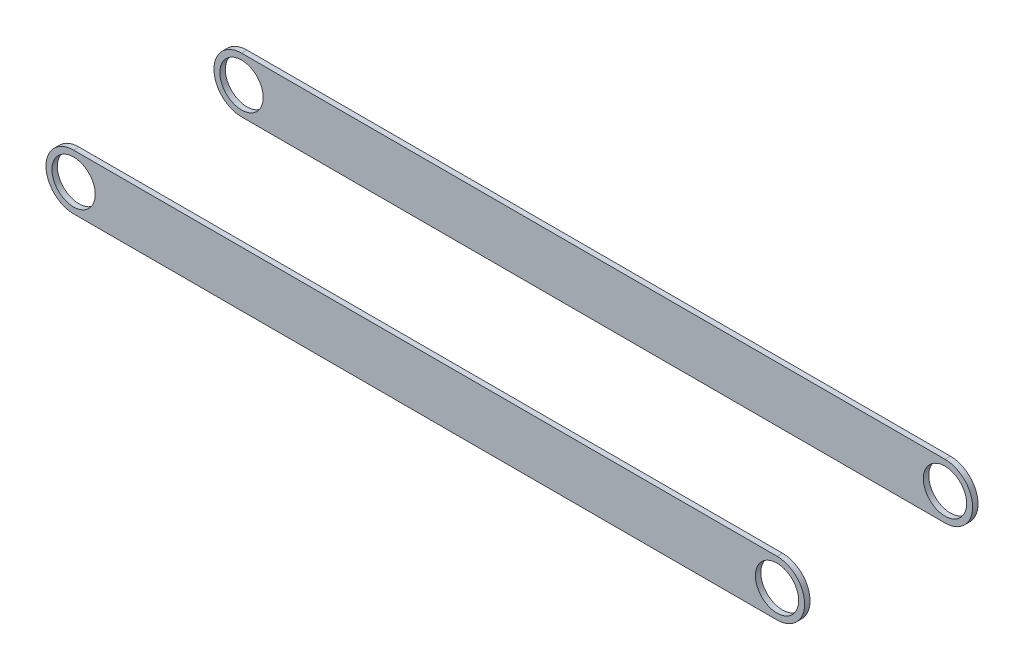
ISO-10303-21;
HEADER;
FILE_DESCRIPTION(('STEP AP214'),'2;1');
FILE_NAME('part.step','',(''),(''),'','','');
FILE_SCHEMA(('AUTOMOTIVE_DESIGN { 1 0 10303 214 1 1 1 1 }'));
ENDSEC;
DATA;
#1=APPLICATION_CONTEXT('core data for automotive mechanical design processes');
#2=APPLICATION_PROTOCOL_DEFINITION('international standard','automotive_design',2000,#1);
#3=PRODUCT_CONTEXT('',#1,'mechanical');
#4=PRODUCT('Part','Part','',(#3));
#5=PRODUCT_RELATED_PRODUCT_CATEGORY('part','',(#4));
#6=PRODUCT_DEFINITION_FORMATION('','',#4);
#7=PRODUCT_DEFINITION_CONTEXT('part definition',#1,'design');
#8=PRODUCT_DEFINITION('design','',#6,#7);
#9=PRODUCT_DEFINITION_SHAPE('','',#8);
#10=(LENGTH_UNIT() NAMED_UNIT(*) SI_UNIT(.MILLI.,.METRE.));
#11=(NAMED_UNIT(*) PLANE_ANGLE_UNIT() SI_UNIT($,.RADIAN.));
#12=(NAMED_UNIT(*) SI_UNIT($,.STERADIAN.) SOLID_ANGLE_UNIT());
#13=UNCERTAINTY_MEASURE_WITH_UNIT(LENGTH_MEASURE(1.E-05),#10,'distance_accuracy_value','');
#14=(GEOMETRIC_REPRESENTATION_CONTEXT(3) GLOBAL_UNCERTAINTY_ASSIGNED_CONTEXT((#13)) GLOBAL_UNIT_ASSIGNED_CONTEXT((#10,
#11,#12)) REPRESENTATION_CONTEXT('',''));
#15=CARTESIAN_POINT('',(0.,0.,0.));
#16=DIRECTION('',(0.,0.,1.));
#17=DIRECTION('',(1.,0.,0.));
#18=AXIS2_PLACEMENT_3D('',#15,#16,#17);
#19=CARTESIAN_POINT('',(7.24644703217118E-13,51.,465.2));
#20=DIRECTION('',(0.,-1.,0.));
#21=DIRECTION('',(1.,0.,0.));
#22=AXIS2_PLACEMENT_3D('',#19,#20,#21);
#23=PLANE('',#22);
#24=DIRECTION('',(-1.,0.,0.));
#25=VECTOR('',#24,1.);
#26=CARTESIAN_POINT('',(7.24644703217118E-13,51.,475.2));
#27=LINE('',#26,#25);
#28=CARTESIAN_POINT('',(7.24753593272954E-13,51.,475.2));
#29=VERTEX_POINT('',#28);
#30=CARTESIAN_POINT('',(-1300.,51.0000000000185,475.2));
#31=VERTEX_POINT('',#30);
#32=EDGE_CURVE('E131',#29,#31,#27,.T.);
#33=ORIENTED_EDGE('',*,*,#32,.F.);
#34=DIRECTION('',(0.,0.,1.));
#35=VECTOR('',#34,1.);
#36=CARTESIAN_POINT('',(7.24753593272954E-13,51.,465.2));
#37=LINE('',#36,#35);
#38=CARTESIAN_POINT('',(7.24753593272954E-13,51.,465.2));
#39=VERTEX_POINT('',#38);
#40=EDGE_CURVE('E124',#39,#29,#37,.T.);
#41=ORIENTED_EDGE('',*,*,#40,.F.);
#42=DIRECTION('',(-1.,0.,0.));
#43=VECTOR('',#42,1.);
#44=CARTESIAN_POINT('',(7.24644703217118E-13,51.,465.2));
#45=LINE('',#44,#43);
#46=CARTESIAN_POINT('',(-1300.,51.0000000000185,465.2));
#47=VERTEX_POINT('',#46);
#48=EDGE_CURVE('E117',#39,#47,#45,.T.);
#49=ORIENTED_EDGE('',*,*,#48,.T.);
#50=DIRECTION('',(0.,0.,1.));
#51=VECTOR('',#50,1.);
#52=CARTESIAN_POINT('',(-1300.,51.0000000000185,465.2));
#53=LINE('',#52,#51);
#54=EDGE_CURVE('E12',#47,#31,#53,.T.);
#55=ORIENTED_EDGE('',*,*,#54,.T.);
#56=EDGE_LOOP('',(#33,#41,#49,#55));
#57=FACE_BOUND('',#56,.T.);
#58=ADVANCED_FACE('F59',(#57),#23,.F.);
#59=CARTESIAN_POINT('',(-1300.,1.84741111297626E-11,465.2));
#60=DIRECTION('',(0.,0.,1.));
#61=DIRECTION('',(-1.,0.,0.));
#62=AXIS2_PLACEMENT_3D('',#59,#60,#61);
#63=CYLINDRICAL_SURFACE('',#62,51.);
#64=CARTESIAN_POINT('',(-1300.,1.84741111297626E-11,475.2));
#65=DIRECTION('',(0.,0.,1.));
#66=DIRECTION('',(1.,0.,0.));
#67=AXIS2_PLACEMENT_3D('',#64,#65,#66);
#68=CIRCLE('',#67,51.);
#69=CARTESIAN_POINT('',(-1300.,-50.9999999999815,475.2));
#70=VERTEX_POINT('',#69);
#71=EDGE_CURVE('E133',#31,#70,#68,.T.);
#72=ORIENTED_EDGE('',*,*,#71,.F.);
#73=ORIENTED_EDGE('',*,*,#54,.F.);
#74=CARTESIAN_POINT('',(-1300.,1.84741111297626E-11,465.2));
#75=DIRECTION('',(0.,0.,1.));
#76=DIRECTION('',(1.,0.,0.));
#77=AXIS2_PLACEMENT_3D('',#74,#75,#76);
#78=CIRCLE('',#77,51.);
#79=CARTESIAN_POINT('',(-1300.,-50.9999999999815,465.2));
#80=VERTEX_POINT('',#79);
#81=EDGE_CURVE('E101',#47,#80,#78,.T.);
#82=ORIENTED_EDGE('',*,*,#81,.T.);
#83=DIRECTION('',(0.,0.,1.));
#84=VECTOR('',#83,1.);
#85=CARTESIAN_POINT('',(-1300.,-50.9999999999815,465.2));
#86=LINE('',#85,#84);
#87=EDGE_CURVE('E68',#80,#70,#86,.T.);
#88=ORIENTED_EDGE('',*,*,#87,.T.);
#89=EDGE_LOOP('',(#72,#73,#82,#88));
#90=FACE_BOUND('',#89,.T.);
#91=ADVANCED_FACE('F115',(#90),#63,.T.);
#92=CARTESIAN_POINT('',(-7.24644703217118E-13,-51.,465.2));
#93=DIRECTION('',(0.,-1.,0.));
#94=DIRECTION('',(1.,0.,0.));
#95=AXIS2_PLACEMENT_3D('',#92,#93,#94);
#96=PLANE('',#95);
#97=DIRECTION('',(-1.,0.,0.));
#98=VECTOR('',#97,1.);
#99=CARTESIAN_POINT('',(-7.24644703217118E-13,-51.,475.2));
#100=LINE('',#99,#98);
#101=CARTESIAN_POINT('',(-7.24753593272954E-13,-51.,475.2));
#102=VERTEX_POINT('',#101);
#103=EDGE_CURVE('E111',#102,#70,#100,.T.);
#104=ORIENTED_EDGE('',*,*,#103,.T.);
#105=ORIENTED_EDGE('',*,*,#87,.F.);
#106=DIRECTION('',(-1.,0.,0.));
#107=VECTOR('',#106,1.);
#108=CARTESIAN_POINT('',(-7.24644703217118E-13,-51.,465.2));
#109=LINE('',#108,#107);
#110=CARTESIAN_POINT('',(-7.24753593272954E-13,-51.,465.2));
#111=VERTEX_POINT('',#110);
#112=EDGE_CURVE('E104',#111,#80,#109,.T.);
#113=ORIENTED_EDGE('',*,*,#112,.F.);
#114=DIRECTION('',(0.,0.,1.));
#115=VECTOR('',#114,1.);
#116=CARTESIAN_POINT('',(-7.24753593272954E-13,-51.,465.2));
#117=LINE('',#116,#115);
#118=EDGE_CURVE('E114',#111,#102,#117,.T.);
#119=ORIENTED_EDGE('',*,*,#118,.T.);
#120=EDGE_LOOP('',(#104,#105,#113,#119));
#121=FACE_BOUND('',#120,.T.);
#122=ADVANCED_FACE('F110',(#121),#96,.T.);
#123=CARTESIAN_POINT('',(0.,0.,465.2));
#124=DIRECTION('',(0.,0.,1.));
#125=DIRECTION('',(-1.,0.,0.));
#126=AXIS2_PLACEMENT_3D('',#123,#124,#125);
#127=CYLINDRICAL_SURFACE('',#126,40.);
#128=CARTESIAN_POINT('',(0.,0.,465.2));
#129=DIRECTION('',(0.,0.,1.));
#130=DIRECTION('',(1.,0.,0.));
#131=AXIS2_PLACEMENT_3D('',#128,#129,#130);
#132=CIRCLE('',#131,40.);
#133=CARTESIAN_POINT('',(40.,0.,465.2));
#134=VERTEX_POINT('',#133);
#135=EDGE_CURVE('E119',#134,#134,#132,.T.);
#136=ORIENTED_EDGE('',*,*,#135,.F.);
#137=EDGE_LOOP('',(#136));
#138=FACE_BOUND('',#137,.T.);
#139=CARTESIAN_POINT('',(0.,0.,475.2));
#140=DIRECTION('',(0.,0.,1.));
#141=DIRECTION('',(1.,0.,0.));
#142=AXIS2_PLACEMENT_3D('',#139,#140,#141);
#143=CIRCLE('',#142,40.);
#144=CARTESIAN_POINT('',(40.,0.,475.2));
#145=VERTEX_POINT('',#144);
#146=EDGE_CURVE('E128',#145,#145,#143,.T.);
#147=ORIENTED_EDGE('',*,*,#146,.T.);
#148=EDGE_LOOP('',(#147));
#149=FACE_BOUND('',#148,.T.);
#150=ADVANCED_FACE('F152',(#138,#149),#127,.F.);
#151=CARTESIAN_POINT('',(-1300.,1.84768866873241E-11,465.2));
#152=DIRECTION('',(0.,0.,1.));
#153=DIRECTION('',(-1.,0.,0.));
#154=AXIS2_PLACEMENT_3D('',#151,#152,#153);
#155=CYLINDRICAL_SURFACE('',#154,39.9999999999999);
#156=CARTESIAN_POINT('',(-1300.,1.84768866873241E-11,465.2));
#157=DIRECTION('',(0.,0.,1.));
#158=DIRECTION('',(1.,0.,0.));
#159=AXIS2_PLACEMENT_3D('',#156,#157,#158);
#160=CIRCLE('',#159,39.9999999999999);
#161=CARTESIAN_POINT('',(-1260.,1.84768866873241E-11,465.2));
#162=VERTEX_POINT('',#161);
#163=EDGE_CURVE('E137',#162,#162,#160,.T.);
#164=ORIENTED_EDGE('',*,*,#163,.F.);
#165=EDGE_LOOP('',(#164));
#166=FACE_BOUND('',#165,.T.);
#167=CARTESIAN_POINT('',(-1300.,1.84768866873241E-11,475.2));
#168=DIRECTION('',(0.,0.,1.));
#169=DIRECTION('',(1.,0.,0.));
#170=AXIS2_PLACEMENT_3D('',#167,#168,#169);
#171=CIRCLE('',#170,39.9999999999999);
#172=CARTESIAN_POINT('',(-1260.,1.84768866873241E-11,475.2));
#173=VERTEX_POINT('',#172);
#174=EDGE_CURVE('E125',#173,#173,#171,.T.);
#175=ORIENTED_EDGE('',*,*,#174,.T.);
#176=EDGE_LOOP('',(#175));
#177=FACE_BOUND('',#176,.T.);
#178=ADVANCED_FACE('F61',(#166,#177),#155,.F.);
#179=CARTESIAN_POINT('',(0.,0.,465.2));
#180=DIRECTION('',(0.,0.,1.));
#181=DIRECTION('',(-1.,0.,0.));
#182=AXIS2_PLACEMENT_3D('',#179,#180,#181);
#183=CYLINDRICAL_SURFACE('',#182,51.);
#184=CARTESIAN_POINT('',(0.,0.,475.2));
#185=DIRECTION('',(0.,0.,1.));
#186=DIRECTION('',(1.,0.,0.));
#187=AXIS2_PLACEMENT_3D('',#184,#185,#186);
#188=CIRCLE('',#187,51.);
#189=EDGE_CURVE('E90',#102,#29,#188,.T.);
#190=ORIENTED_EDGE('',*,*,#189,.F.);
#191=ORIENTED_EDGE('',*,*,#118,.F.);
#192=CARTESIAN_POINT('',(0.,0.,465.2));
#193=DIRECTION('',(0.,0.,1.));
#194=DIRECTION('',(1.,0.,0.));
#195=AXIS2_PLACEMENT_3D('',#192,#193,#194);
#196=CIRCLE('',#195,51.);
#197=EDGE_CURVE('E76',#111,#39,#196,.T.);
#198=ORIENTED_EDGE('',*,*,#197,.T.);
#199=ORIENTED_EDGE('',*,*,#40,.T.);
#200=EDGE_LOOP('',(#190,#191,#198,#199));
#201=FACE_BOUND('',#200,.T.);
#202=ADVANCED_FACE('F143',(#201),#183,.T.);
#203=CARTESIAN_POINT('',(0.,0.,465.2));
#204=DIRECTION('',(0.,0.,-1.));
#205=DIRECTION('',(1.,0.,0.));
#206=AXIS2_PLACEMENT_3D('',#203,#204,#205);
#207=PLANE('',#206);
#208=ORIENTED_EDGE('',*,*,#163,.T.);
#209=EDGE_LOOP('',(#208));
#210=FACE_BOUND('',#209,.T.);
#211=ORIENTED_EDGE('',*,*,#135,.T.);
#212=EDGE_LOOP('',(#211));
#213=FACE_BOUND('',#212,.T.);
#214=ORIENTED_EDGE('',*,*,#48,.F.);
#215=ORIENTED_EDGE('',*,*,#197,.F.);
#216=ORIENTED_EDGE('',*,*,#112,.T.);
#217=ORIENTED_EDGE('',*,*,#81,.F.);
#218=EDGE_LOOP('',(#214,#215,#216,#217));
#219=FACE_BOUND('',#218,.T.);
#220=ADVANCED_FACE('F106',(#210,#213,#219),#207,.T.);
#221=CARTESIAN_POINT('',(0.,0.,475.2));
#222=DIRECTION('',(0.,0.,-1.));
#223=DIRECTION('',(1.,0.,0.));
#224=AXIS2_PLACEMENT_3D('',#221,#222,#223);
#225=PLANE('',#224);
#226=ORIENTED_EDGE('',*,*,#174,.F.);
#227=EDGE_LOOP('',(#226));
#228=FACE_BOUND('',#227,.T.);
#229=ORIENTED_EDGE('',*,*,#146,.F.);
#230=EDGE_LOOP('',(#229));
#231=FACE_BOUND('',#230,.T.);
#232=ORIENTED_EDGE('',*,*,#32,.T.);
#233=ORIENTED_EDGE('',*,*,#71,.T.);
#234=ORIENTED_EDGE('',*,*,#103,.F.);
#235=ORIENTED_EDGE('',*,*,#189,.T.);
#236=EDGE_LOOP('',(#232,#233,#234,#235));
#237=FACE_BOUND('',#236,.T.);
#238=ADVANCED_FACE('F139',(#228,#231,#237),#225,.F.);
#239=CLOSED_SHELL('',(#58,#91,#122,#150,#178,#202,#220,#238));
#240=MANIFOLD_SOLID_BREP('B2',#239);
#241=CARTESIAN_POINT('',(7.24644703217118E-13,51.,164.8));
#242=DIRECTION('',(0.,-1.,0.));
#243=DIRECTION('',(1.,0.,0.));
#244=AXIS2_PLACEMENT_3D('',#241,#242,#243);
#245=PLANE('',#244);
#246=DIRECTION('',(-1.,0.,0.));
#247=VECTOR('',#246,1.);
#248=CARTESIAN_POINT('',(7.24644703217118E-13,51.,154.8));
#249=LINE('',#248,#247);
#250=CARTESIAN_POINT('',(7.24753593272954E-13,51.,154.8));
#251=VERTEX_POINT('',#250);
#252=CARTESIAN_POINT('',(-1300.,51.0000000000185,154.8));
#253=VERTEX_POINT('',#252);
#254=EDGE_CURVE('E301',#251,#253,#249,.T.);
#255=ORIENTED_EDGE('',*,*,#254,.T.);
#256=DIRECTION('',(0.,0.,-1.));
#257=VECTOR('',#256,1.);
#258=CARTESIAN_POINT('',(-1300.,51.0000000000185,164.8));
#259=LINE('',#258,#257);
#260=CARTESIAN_POINT('',(-1300.,51.0000000000185,164.8));
#261=VERTEX_POINT('',#260);
#262=EDGE_CURVE('E57',#261,#253,#259,.T.);
#263=ORIENTED_EDGE('',*,*,#262,.F.);
#264=DIRECTION('',(-1.,0.,0.));
#265=VECTOR('',#264,1.);
#266=CARTESIAN_POINT('',(7.24644703217118E-13,51.,164.8));
#267=LINE('',#266,#265);
#268=CARTESIAN_POINT('',(7.24753593272954E-13,51.,164.8));
#269=VERTEX_POINT('',#268);
#270=EDGE_CURVE('E274',#269,#261,#267,.T.);
#271=ORIENTED_EDGE('',*,*,#270,.F.);
#272=DIRECTION('',(0.,0.,-1.));
#273=VECTOR('',#272,1.);
#274=CARTESIAN_POINT('',(7.24753593272954E-13,51.,164.8));
#275=LINE('',#274,#273);
#276=EDGE_CURVE('E289',#269,#251,#275,.T.);
#277=ORIENTED_EDGE('',*,*,#276,.T.);
#278=EDGE_LOOP('',(#255,#263,#271,#277));
#279=FACE_BOUND('',#278,.T.);
#280=ADVANCED_FACE('F225',(#279),#245,.F.);
#281=CARTESIAN_POINT('',(-1300.,1.84741111297626E-11,164.8));
#282=DIRECTION('',(0.,0.,-1.));
#283=DIRECTION('',(-1.,0.,0.));
#284=AXIS2_PLACEMENT_3D('',#281,#282,#283);
#285=CYLINDRICAL_SURFACE('',#284,51.);
#286=CARTESIAN_POINT('',(-1300.,1.84741111297626E-11,154.8));
#287=DIRECTION('',(0.,0.,1.));
#288=DIRECTION('',(1.,0.,0.));
#289=AXIS2_PLACEMENT_3D('',#286,#287,#288);
#290=CIRCLE('',#289,51.);
#291=CARTESIAN_POINT('',(-1300.,-50.9999999999815,154.8));
#292=VERTEX_POINT('',#291);
#293=EDGE_CURVE('E280',#253,#292,#290,.T.);
#294=ORIENTED_EDGE('',*,*,#293,.T.);
#295=DIRECTION('',(0.,0.,-1.));
#296=VECTOR('',#295,1.);
#297=CARTESIAN_POINT('',(-1300.,-50.9999999999815,164.8));
#298=LINE('',#297,#296);
#299=CARTESIAN_POINT('',(-1300.,-50.9999999999815,164.8));
#300=VERTEX_POINT('',#299);
#301=EDGE_CURVE('E235',#300,#292,#298,.T.);
#302=ORIENTED_EDGE('',*,*,#301,.F.);
#303=CARTESIAN_POINT('',(-1300.,1.84741111297626E-11,164.8));
#304=DIRECTION('',(0.,0.,1.));
#305=DIRECTION('',(1.,0.,0.));
#306=AXIS2_PLACEMENT_3D('',#303,#304,#305);
#307=CIRCLE('',#306,51.);
#308=EDGE_CURVE('E269',#261,#300,#307,.T.);
#309=ORIENTED_EDGE('',*,*,#308,.F.);
#310=ORIENTED_EDGE('',*,*,#262,.T.);
#311=EDGE_LOOP('',(#294,#302,#309,#310));
#312=FACE_BOUND('',#311,.T.);
#313=ADVANCED_FACE('F279',(#312),#285,.T.);
#314=CARTESIAN_POINT('',(-7.24644703217118E-13,-51.,164.8));
#315=DIRECTION('',(0.,-1.,0.));
#316=DIRECTION('',(1.,0.,0.));
#317=AXIS2_PLACEMENT_3D('',#314,#315,#316);
#318=PLANE('',#317);
#319=DIRECTION('',(-1.,0.,0.));
#320=VECTOR('',#319,1.);
#321=CARTESIAN_POINT('',(-7.24644703217118E-13,-51.,154.8));
#322=LINE('',#321,#320);
#323=CARTESIAN_POINT('',(-7.24753593272954E-13,-51.,154.8));
#324=VERTEX_POINT('',#323);
#325=EDGE_CURVE('E307',#324,#292,#322,.T.);
#326=ORIENTED_EDGE('',*,*,#325,.F.);
#327=DIRECTION('',(0.,0.,-1.));
#328=VECTOR('',#327,1.);
#329=CARTESIAN_POINT('',(-7.24753593272954E-13,-51.,164.8));
#330=LINE('',#329,#328);
#331=CARTESIAN_POINT('',(-7.24753593272954E-13,-51.,164.8));
#332=VERTEX_POINT('',#331);
#333=EDGE_CURVE('E259',#332,#324,#330,.T.);
#334=ORIENTED_EDGE('',*,*,#333,.F.);
#335=DIRECTION('',(-1.,0.,0.));
#336=VECTOR('',#335,1.);
#337=CARTESIAN_POINT('',(-7.24644703217118E-13,-51.,164.8));
#338=LINE('',#337,#336);
#339=EDGE_CURVE('E272',#332,#300,#338,.T.);
#340=ORIENTED_EDGE('',*,*,#339,.T.);
#341=ORIENTED_EDGE('',*,*,#301,.T.);
#342=EDGE_LOOP('',(#326,#334,#340,#341));
#343=FACE_BOUND('',#342,.T.);
#344=ADVANCED_FACE('F285',(#343),#318,.T.);
#345=CARTESIAN_POINT('',(0.,0.,164.8));
#346=DIRECTION('',(0.,0.,-1.));
#347=DIRECTION('',(-1.,0.,0.));
#348=AXIS2_PLACEMENT_3D('',#345,#346,#347);
#349=CYLINDRICAL_SURFACE('',#348,40.);
#350=CARTESIAN_POINT('',(0.,0.,164.8));
#351=DIRECTION('',(0.,0.,1.));
#352=DIRECTION('',(1.,0.,0.));
#353=AXIS2_PLACEMENT_3D('',#350,#351,#352);
#354=CIRCLE('',#353,40.);
#355=CARTESIAN_POINT('',(40.,0.,164.8));
#356=VERTEX_POINT('',#355);
#357=EDGE_CURVE('E349',#356,#356,#354,.T.);
#358=ORIENTED_EDGE('',*,*,#357,.T.);
#359=EDGE_LOOP('',(#358));
#360=FACE_BOUND('',#359,.T.);
#361=CARTESIAN_POINT('',(0.,0.,154.8));
#362=DIRECTION('',(0.,0.,1.));
#363=DIRECTION('',(1.,0.,0.));
#364=AXIS2_PLACEMENT_3D('',#361,#362,#363);
#365=CIRCLE('',#364,40.);
#366=CARTESIAN_POINT('',(40.,0.,154.8));
#367=VERTEX_POINT('',#366);
#368=EDGE_CURVE('E297',#367,#367,#365,.T.);
#369=ORIENTED_EDGE('',*,*,#368,.F.);
#370=EDGE_LOOP('',(#369));
#371=FACE_BOUND('',#370,.T.);
#372=ADVANCED_FACE('F338',(#360,#371),#349,.F.);
#373=CARTESIAN_POINT('',(-1300.,1.84768866873241E-11,164.8));
#374=DIRECTION('',(0.,0.,-1.));
#375=DIRECTION('',(-1.,0.,0.));
#376=AXIS2_PLACEMENT_3D('',#373,#374,#375);
#377=CYLINDRICAL_SURFACE('',#376,39.9999999999999);
#378=CARTESIAN_POINT('',(-1300.,1.84768866873241E-11,164.8));
#379=DIRECTION('',(0.,0.,1.));
#380=DIRECTION('',(1.,0.,0.));
#381=AXIS2_PLACEMENT_3D('',#378,#379,#380);
#382=CIRCLE('',#381,39.9999999999999);
#383=CARTESIAN_POINT('',(-1260.,1.84768866873241E-11,164.8));
#384=VERTEX_POINT('',#383);
#385=EDGE_CURVE('E312',#384,#384,#382,.T.);
#386=ORIENTED_EDGE('',*,*,#385,.T.);
#387=EDGE_LOOP('',(#386));
#388=FACE_BOUND('',#387,.T.);
#389=CARTESIAN_POINT('',(-1300.,1.84768866873241E-11,154.8));
#390=DIRECTION('',(0.,0.,1.));
#391=DIRECTION('',(1.,0.,0.));
#392=AXIS2_PLACEMENT_3D('',#389,#390,#391);
#393=CIRCLE('',#392,39.9999999999999);
#394=CARTESIAN_POINT('',(-1260.,1.84768866873241E-11,154.8));
#395=VERTEX_POINT('',#394);
#396=EDGE_CURVE('E293',#395,#395,#393,.T.);
#397=ORIENTED_EDGE('',*,*,#396,.F.);
#398=EDGE_LOOP('',(#397));
#399=FACE_BOUND('',#398,.T.);
#400=ADVANCED_FACE('F227',(#388,#399),#377,.F.);
#401=CARTESIAN_POINT('',(0.,0.,164.8));
#402=DIRECTION('',(0.,0.,-1.));
#403=DIRECTION('',(-1.,0.,0.));
#404=AXIS2_PLACEMENT_3D('',#401,#402,#403);
#405=CYLINDRICAL_SURFACE('',#404,51.);
#406=CARTESIAN_POINT('',(0.,0.,154.8));
#407=DIRECTION('',(0.,0.,1.));
#408=DIRECTION('',(1.,0.,0.));
#409=AXIS2_PLACEMENT_3D('',#406,#407,#408);
#410=CIRCLE('',#409,51.);
#411=EDGE_CURVE('E262',#324,#251,#410,.T.);
#412=ORIENTED_EDGE('',*,*,#411,.T.);
#413=ORIENTED_EDGE('',*,*,#276,.F.);
#414=CARTESIAN_POINT('',(0.,0.,164.8));
#415=DIRECTION('',(0.,0.,1.));
#416=DIRECTION('',(1.,0.,0.));
#417=AXIS2_PLACEMENT_3D('',#414,#415,#416);
#418=CIRCLE('',#417,51.);
#419=EDGE_CURVE('E243',#332,#269,#418,.T.);
#420=ORIENTED_EDGE('',*,*,#419,.F.);
#421=ORIENTED_EDGE('',*,*,#333,.T.);
#422=EDGE_LOOP('',(#412,#413,#420,#421));
#423=FACE_BOUND('',#422,.T.);
#424=ADVANCED_FACE('F326',(#423),#405,.T.);
#425=CARTESIAN_POINT('',(0.,0.,164.8));
#426=DIRECTION('',(0.,0.,1.));
#427=DIRECTION('',(1.,0.,0.));
#428=AXIS2_PLACEMENT_3D('',#425,#426,#427);
#429=PLANE('',#428);
#430=ORIENTED_EDGE('',*,*,#385,.F.);
#431=EDGE_LOOP('',(#430));
#432=FACE_BOUND('',#431,.T.);
#433=ORIENTED_EDGE('',*,*,#357,.F.);
#434=EDGE_LOOP('',(#433));
#435=FACE_BOUND('',#434,.T.);
#436=ORIENTED_EDGE('',*,*,#270,.T.);
#437=ORIENTED_EDGE('',*,*,#308,.T.);
#438=ORIENTED_EDGE('',*,*,#339,.F.);
#439=ORIENTED_EDGE('',*,*,#419,.T.);
#440=EDGE_LOOP('',(#436,#437,#438,#439));
#441=FACE_BOUND('',#440,.T.);
#442=ADVANCED_FACE('F270',(#432,#435,#441),#429,.T.);
#443=CARTESIAN_POINT('',(0.,0.,154.8));
#444=DIRECTION('',(0.,0.,1.));
#445=DIRECTION('',(1.,0.,0.));
#446=AXIS2_PLACEMENT_3D('',#443,#444,#445);
#447=PLANE('',#446);
#448=ORIENTED_EDGE('',*,*,#396,.T.);
#449=EDGE_LOOP('',(#448));
#450=FACE_BOUND('',#449,.T.);
#451=ORIENTED_EDGE('',*,*,#368,.T.);
#452=EDGE_LOOP('',(#451));
#453=FACE_BOUND('',#452,.T.);
#454=ORIENTED_EDGE('',*,*,#254,.F.);
#455=ORIENTED_EDGE('',*,*,#411,.F.);
#456=ORIENTED_EDGE('',*,*,#325,.T.);
#457=ORIENTED_EDGE('',*,*,#293,.F.);
#458=EDGE_LOOP('',(#454,#455,#456,#457));
#459=FACE_BOUND('',#458,.T.);
#460=ADVANCED_FACE('F319',(#450,#453,#459),#447,.F.);
#461=CLOSED_SHELL('',(#280,#313,#344,#372,#400,#424,#442,#460));
#462=MANIFOLD_SOLID_BREP('B6',#461);
#463=ADVANCED_BREP_SHAPE_REPRESENTATION('',(#18,#240,#462),#14);
#464=SHAPE_DEFINITION_REPRESENTATION(#9,#463);
ENDSEC;
END-ISO-10303-21;
